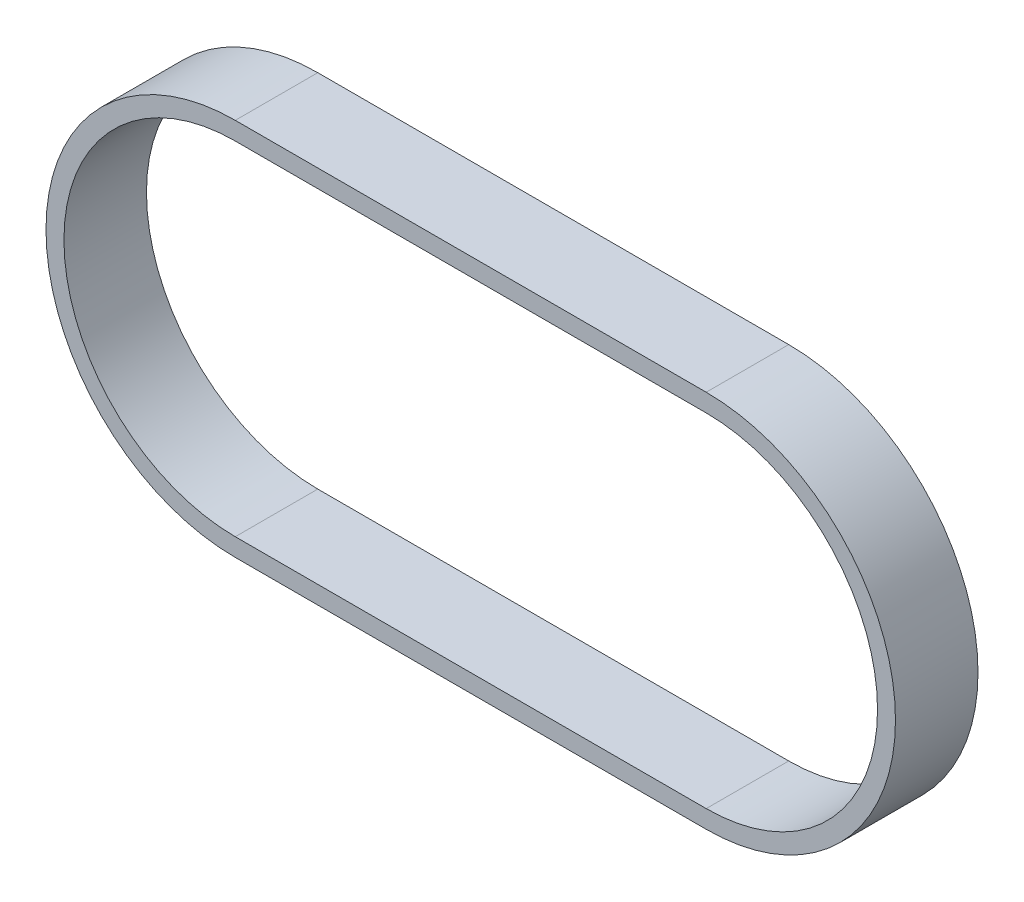
ISO-10303-21;
HEADER;
FILE_DESCRIPTION(('STEP AP214'),'2;1');
FILE_NAME('part.step','',(''),(''),'','','');
FILE_SCHEMA(('AUTOMOTIVE_DESIGN { 1 0 10303 214 1 1 1 1 }'));
ENDSEC;
DATA;
#1=APPLICATION_CONTEXT('core data for automotive mechanical design processes');
#2=APPLICATION_PROTOCOL_DEFINITION('international standard','automotive_design',2000,#1);
#3=PRODUCT_CONTEXT('',#1,'mechanical');
#4=PRODUCT('Part','Part','',(#3));
#5=PRODUCT_RELATED_PRODUCT_CATEGORY('part','',(#4));
#6=PRODUCT_DEFINITION_FORMATION('','',#4);
#7=PRODUCT_DEFINITION_CONTEXT('part definition',#1,'design');
#8=PRODUCT_DEFINITION('design','',#6,#7);
#9=PRODUCT_DEFINITION_SHAPE('','',#8);
#10=(LENGTH_UNIT() NAMED_UNIT(*) SI_UNIT(.MILLI.,.METRE.));
#11=(NAMED_UNIT(*) PLANE_ANGLE_UNIT() SI_UNIT($,.RADIAN.));
#12=(NAMED_UNIT(*) SI_UNIT($,.STERADIAN.) SOLID_ANGLE_UNIT());
#13=UNCERTAINTY_MEASURE_WITH_UNIT(LENGTH_MEASURE(1.E-05),#10,'distance_accuracy_value','');
#14=(GEOMETRIC_REPRESENTATION_CONTEXT(3) GLOBAL_UNCERTAINTY_ASSIGNED_CONTEXT((#13)) GLOBAL_UNIT_ASSIGNED_CONTEXT((#10,
#11,#12)) REPRESENTATION_CONTEXT('',''));
#15=CARTESIAN_POINT('',(0.,0.,0.));
#16=DIRECTION('',(0.,0.,1.));
#17=DIRECTION('',(1.,0.,0.));
#18=AXIS2_PLACEMENT_3D('',#15,#16,#17);
#19=CARTESIAN_POINT('',(0.,0.,9.2));
#20=DIRECTION('',(0.,0.,1.));
#21=DIRECTION('',(1.,0.,0.));
#22=AXIS2_PLACEMENT_3D('',#19,#20,#21);
#23=PLANE('',#22);
#24=CARTESIAN_POINT('',(0.,0.,9.2));
#25=DIRECTION('',(0.,0.,1.));
#26=DIRECTION('',(1.,0.,0.));
#27=AXIS2_PLACEMENT_3D('',#24,#25,#26);
#28=CIRCLE('',#27,21.1);
#29=CARTESIAN_POINT('',(0.,21.1,9.2));
#30=VERTEX_POINT('',#29);
#31=CARTESIAN_POINT('',(0.,-21.1,9.2));
#32=VERTEX_POINT('',#31);
#33=EDGE_CURVE('E160',#30,#32,#28,.T.);
#34=ORIENTED_EDGE('',*,*,#33,.T.);
#35=DIRECTION('',(1.,0.,0.));
#36=VECTOR('',#35,1.);
#37=CARTESIAN_POINT('',(0.,-21.1,9.2));
#38=LINE('',#37,#36);
#39=CARTESIAN_POINT('',(52.5,-21.1,9.2));
#40=VERTEX_POINT('',#39);
#41=EDGE_CURVE('E163',#32,#40,#38,.T.);
#42=ORIENTED_EDGE('',*,*,#41,.T.);
#43=CARTESIAN_POINT('',(52.5,0.,9.2));
#44=DIRECTION('',(0.,0.,1.));
#45=DIRECTION('',(1.,0.,0.));
#46=AXIS2_PLACEMENT_3D('',#43,#44,#45);
#47=CIRCLE('',#46,21.1);
#48=CARTESIAN_POINT('',(52.5,21.1,9.2));
#49=VERTEX_POINT('',#48);
#50=EDGE_CURVE('E166',#40,#49,#47,.T.);
#51=ORIENTED_EDGE('',*,*,#50,.T.);
#52=DIRECTION('',(-1.,0.,0.));
#53=VECTOR('',#52,1.);
#54=CARTESIAN_POINT('',(0.,21.1,9.2));
#55=LINE('',#54,#53);
#56=EDGE_CURVE('E168',#49,#30,#55,.T.);
#57=ORIENTED_EDGE('',*,*,#56,.T.);
#58=EDGE_LOOP('',(#34,#42,#51,#57));
#59=FACE_BOUND('',#58,.T.);
#60=DIRECTION('',(1.,0.,0.));
#61=VECTOR('',#60,1.);
#62=CARTESIAN_POINT('',(0.,-19.1,9.2));
#63=LINE('',#62,#61);
#64=CARTESIAN_POINT('',(0.,-19.1,9.2));
#65=VERTEX_POINT('',#64);
#66=CARTESIAN_POINT('',(52.5,-19.1,9.2));
#67=VERTEX_POINT('',#66);
#68=EDGE_CURVE('E132',#65,#67,#63,.T.);
#69=ORIENTED_EDGE('',*,*,#68,.F.);
#70=CARTESIAN_POINT('',(0.,0.,9.2));
#71=DIRECTION('',(0.,0.,1.));
#72=DIRECTION('',(1.,0.,0.));
#73=AXIS2_PLACEMENT_3D('',#70,#71,#72);
#74=CIRCLE('',#73,19.1);
#75=CARTESIAN_POINT('',(0.,19.1,9.2));
#76=VERTEX_POINT('',#75);
#77=EDGE_CURVE('E124',#76,#65,#74,.T.);
#78=ORIENTED_EDGE('',*,*,#77,.F.);
#79=DIRECTION('',(-1.,0.,0.));
#80=VECTOR('',#79,1.);
#81=CARTESIAN_POINT('',(0.,19.1,9.2));
#82=LINE('',#81,#80);
#83=CARTESIAN_POINT('',(52.5,19.1,9.2));
#84=VERTEX_POINT('',#83);
#85=EDGE_CURVE('E146',#84,#76,#82,.T.);
#86=ORIENTED_EDGE('',*,*,#85,.F.);
#87=CARTESIAN_POINT('',(52.5,0.,9.2));
#88=DIRECTION('',(0.,0.,1.));
#89=DIRECTION('',(1.,0.,0.));
#90=AXIS2_PLACEMENT_3D('',#87,#88,#89);
#91=CIRCLE('',#90,19.1);
#92=EDGE_CURVE('E144',#67,#84,#91,.T.);
#93=ORIENTED_EDGE('',*,*,#92,.F.);
#94=EDGE_LOOP('',(#69,#78,#86,#93));
#95=FACE_BOUND('',#94,.T.);
#96=ADVANCED_FACE('F59',(#59,#95),#23,.T.);
#97=CARTESIAN_POINT('',(0.,0.,0.));
#98=DIRECTION('',(0.,0.,1.));
#99=DIRECTION('',(1.,0.,0.));
#100=AXIS2_PLACEMENT_3D('',#97,#98,#99);
#101=PLANE('',#100);
#102=CARTESIAN_POINT('',(0.,0.,0.));
#103=DIRECTION('',(0.,0.,1.));
#104=DIRECTION('',(1.,0.,0.));
#105=AXIS2_PLACEMENT_3D('',#102,#103,#104);
#106=CIRCLE('',#105,21.1);
#107=CARTESIAN_POINT('',(0.,21.1,0.));
#108=VERTEX_POINT('',#107);
#109=CARTESIAN_POINT('',(0.,-21.1,0.));
#110=VERTEX_POINT('',#109);
#111=EDGE_CURVE('E140',#108,#110,#106,.T.);
#112=ORIENTED_EDGE('',*,*,#111,.F.);
#113=DIRECTION('',(-1.,0.,0.));
#114=VECTOR('',#113,1.);
#115=CARTESIAN_POINT('',(0.,21.1,0.));
#116=LINE('',#115,#114);
#117=CARTESIAN_POINT('',(52.5,21.1,0.));
#118=VERTEX_POINT('',#117);
#119=EDGE_CURVE('E164',#118,#108,#116,.T.);
#120=ORIENTED_EDGE('',*,*,#119,.F.);
#121=CARTESIAN_POINT('',(52.5,0.,0.));
#122=DIRECTION('',(0.,0.,1.));
#123=DIRECTION('',(1.,0.,0.));
#124=AXIS2_PLACEMENT_3D('',#121,#122,#123);
#125=CIRCLE('',#124,21.1);
#126=CARTESIAN_POINT('',(52.5,-21.1,0.));
#127=VERTEX_POINT('',#126);
#128=EDGE_CURVE('E175',#127,#118,#125,.T.);
#129=ORIENTED_EDGE('',*,*,#128,.F.);
#130=DIRECTION('',(1.,0.,0.));
#131=VECTOR('',#130,1.);
#132=CARTESIAN_POINT('',(0.,-21.1,0.));
#133=LINE('',#132,#131);
#134=EDGE_CURVE('E173',#110,#127,#133,.T.);
#135=ORIENTED_EDGE('',*,*,#134,.F.);
#136=EDGE_LOOP('',(#112,#120,#129,#135));
#137=FACE_BOUND('',#136,.T.);
#138=CARTESIAN_POINT('',(0.,0.,0.));
#139=DIRECTION('',(0.,0.,1.));
#140=DIRECTION('',(1.,0.,0.));
#141=AXIS2_PLACEMENT_3D('',#138,#139,#140);
#142=CIRCLE('',#141,19.1);
#143=CARTESIAN_POINT('',(0.,19.1,0.));
#144=VERTEX_POINT('',#143);
#145=CARTESIAN_POINT('',(0.,-19.1,0.));
#146=VERTEX_POINT('',#145);
#147=EDGE_CURVE('E82',#144,#146,#142,.T.);
#148=ORIENTED_EDGE('',*,*,#147,.T.);
#149=DIRECTION('',(1.,0.,0.));
#150=VECTOR('',#149,1.);
#151=CARTESIAN_POINT('',(0.,-19.1,0.));
#152=LINE('',#151,#150);
#153=CARTESIAN_POINT('',(52.5,-19.1,0.));
#154=VERTEX_POINT('',#153);
#155=EDGE_CURVE('E139',#146,#154,#152,.T.);
#156=ORIENTED_EDGE('',*,*,#155,.T.);
#157=CARTESIAN_POINT('',(52.5,0.,0.));
#158=DIRECTION('',(0.,0.,1.));
#159=DIRECTION('',(1.,0.,0.));
#160=AXIS2_PLACEMENT_3D('',#157,#158,#159);
#161=CIRCLE('',#160,19.1);
#162=CARTESIAN_POINT('',(52.5,19.1,0.));
#163=VERTEX_POINT('',#162);
#164=EDGE_CURVE('E152',#154,#163,#161,.T.);
#165=ORIENTED_EDGE('',*,*,#164,.T.);
#166=DIRECTION('',(-1.,0.,0.));
#167=VECTOR('',#166,1.);
#168=CARTESIAN_POINT('',(0.,19.1,0.));
#169=LINE('',#168,#167);
#170=EDGE_CURVE('E133',#163,#144,#169,.T.);
#171=ORIENTED_EDGE('',*,*,#170,.T.);
#172=EDGE_LOOP('',(#148,#156,#165,#171));
#173=FACE_BOUND('',#172,.T.);
#174=ADVANCED_FACE('F193',(#137,#173),#101,.F.);
#175=CARTESIAN_POINT('',(0.,0.,9.2));
#176=DIRECTION('',(0.,0.,-1.));
#177=DIRECTION('',(-1.,0.,0.));
#178=AXIS2_PLACEMENT_3D('',#175,#176,#177);
#179=CYLINDRICAL_SURFACE('',#178,21.1);
#180=ORIENTED_EDGE('',*,*,#111,.T.);
#181=DIRECTION('',(0.,0.,-1.));
#182=VECTOR('',#181,1.);
#183=CARTESIAN_POINT('',(0.,-21.1,9.2));
#184=LINE('',#183,#182);
#185=EDGE_CURVE('E12',#32,#110,#184,.T.);
#186=ORIENTED_EDGE('',*,*,#185,.F.);
#187=ORIENTED_EDGE('',*,*,#33,.F.);
#188=DIRECTION('',(0.,0.,-1.));
#189=VECTOR('',#188,1.);
#190=CARTESIAN_POINT('',(0.,21.1,9.2));
#191=LINE('',#190,#189);
#192=EDGE_CURVE('E170',#30,#108,#191,.T.);
#193=ORIENTED_EDGE('',*,*,#192,.T.);
#194=EDGE_LOOP('',(#180,#186,#187,#193));
#195=FACE_BOUND('',#194,.T.);
#196=ADVANCED_FACE('F61',(#195),#179,.T.);
#197=CARTESIAN_POINT('',(0.,-21.1,9.2));
#198=DIRECTION('',(0.,1.,0.));
#199=DIRECTION('',(-1.,0.,0.));
#200=AXIS2_PLACEMENT_3D('',#197,#198,#199);
#201=PLANE('',#200);
#202=ORIENTED_EDGE('',*,*,#134,.T.);
#203=DIRECTION('',(0.,0.,-1.));
#204=VECTOR('',#203,1.);
#205=CARTESIAN_POINT('',(52.5,-21.1,9.2));
#206=LINE('',#205,#204);
#207=EDGE_CURVE('E67',#40,#127,#206,.T.);
#208=ORIENTED_EDGE('',*,*,#207,.F.);
#209=ORIENTED_EDGE('',*,*,#41,.F.);
#210=ORIENTED_EDGE('',*,*,#185,.T.);
#211=EDGE_LOOP('',(#202,#208,#209,#210));
#212=FACE_BOUND('',#211,.T.);
#213=ADVANCED_FACE('F203',(#212),#201,.F.);
#214=CARTESIAN_POINT('',(52.5,0.,9.2));
#215=DIRECTION('',(0.,0.,-1.));
#216=DIRECTION('',(-1.,0.,0.));
#217=AXIS2_PLACEMENT_3D('',#214,#215,#216);
#218=CYLINDRICAL_SURFACE('',#217,21.1);
#219=ORIENTED_EDGE('',*,*,#128,.T.);
#220=DIRECTION('',(0.,0.,-1.));
#221=VECTOR('',#220,1.);
#222=CARTESIAN_POINT('',(52.5,21.1,9.2));
#223=LINE('',#222,#221);
#224=EDGE_CURVE('E180',#49,#118,#223,.T.);
#225=ORIENTED_EDGE('',*,*,#224,.F.);
#226=ORIENTED_EDGE('',*,*,#50,.F.);
#227=ORIENTED_EDGE('',*,*,#207,.T.);
#228=EDGE_LOOP('',(#219,#225,#226,#227));
#229=FACE_BOUND('',#228,.T.);
#230=ADVANCED_FACE('F187',(#229),#218,.T.);
#231=CARTESIAN_POINT('',(0.,21.1,9.2));
#232=DIRECTION('',(0.,-1.,0.));
#233=DIRECTION('',(1.,0.,0.));
#234=AXIS2_PLACEMENT_3D('',#231,#232,#233);
#235=PLANE('',#234);
#236=ORIENTED_EDGE('',*,*,#119,.T.);
#237=ORIENTED_EDGE('',*,*,#192,.F.);
#238=ORIENTED_EDGE('',*,*,#56,.F.);
#239=ORIENTED_EDGE('',*,*,#224,.T.);
#240=EDGE_LOOP('',(#236,#237,#238,#239));
#241=FACE_BOUND('',#240,.T.);
#242=ADVANCED_FACE('F197',(#241),#235,.F.);
#243=CARTESIAN_POINT('',(0.,0.,9.2));
#244=DIRECTION('',(0.,0.,-1.));
#245=DIRECTION('',(-1.,0.,0.));
#246=AXIS2_PLACEMENT_3D('',#243,#244,#245);
#247=CYLINDRICAL_SURFACE('',#246,19.1);
#248=ORIENTED_EDGE('',*,*,#147,.F.);
#249=DIRECTION('',(0.,0.,-1.));
#250=VECTOR('',#249,1.);
#251=CARTESIAN_POINT('',(0.,19.1,9.2));
#252=LINE('',#251,#250);
#253=EDGE_CURVE('E128',#76,#144,#252,.T.);
#254=ORIENTED_EDGE('',*,*,#253,.F.);
#255=ORIENTED_EDGE('',*,*,#77,.T.);
#256=DIRECTION('',(0.,0.,-1.));
#257=VECTOR('',#256,1.);
#258=CARTESIAN_POINT('',(0.,-19.1,9.2));
#259=LINE('',#258,#257);
#260=EDGE_CURVE('E127',#65,#146,#259,.T.);
#261=ORIENTED_EDGE('',*,*,#260,.T.);
#262=EDGE_LOOP('',(#248,#254,#255,#261));
#263=FACE_BOUND('',#262,.T.);
#264=ADVANCED_FACE('F126',(#263),#247,.F.);
#265=CARTESIAN_POINT('',(0.,-19.1,9.2));
#266=DIRECTION('',(0.,1.,0.));
#267=DIRECTION('',(-1.,0.,0.));
#268=AXIS2_PLACEMENT_3D('',#265,#266,#267);
#269=PLANE('',#268);
#270=ORIENTED_EDGE('',*,*,#155,.F.);
#271=ORIENTED_EDGE('',*,*,#260,.F.);
#272=ORIENTED_EDGE('',*,*,#68,.T.);
#273=DIRECTION('',(0.,0.,-1.));
#274=VECTOR('',#273,1.);
#275=CARTESIAN_POINT('',(52.5,-19.1,9.2));
#276=LINE('',#275,#274);
#277=EDGE_CURVE('E141',#67,#154,#276,.T.);
#278=ORIENTED_EDGE('',*,*,#277,.T.);
#279=EDGE_LOOP('',(#270,#271,#272,#278));
#280=FACE_BOUND('',#279,.T.);
#281=ADVANCED_FACE('F136',(#280),#269,.T.);
#282=CARTESIAN_POINT('',(52.5,0.,9.2));
#283=DIRECTION('',(0.,0.,-1.));
#284=DIRECTION('',(-1.,0.,0.));
#285=AXIS2_PLACEMENT_3D('',#282,#283,#284);
#286=CYLINDRICAL_SURFACE('',#285,19.1);
#287=ORIENTED_EDGE('',*,*,#164,.F.);
#288=ORIENTED_EDGE('',*,*,#277,.F.);
#289=ORIENTED_EDGE('',*,*,#92,.T.);
#290=DIRECTION('',(0.,0.,-1.));
#291=VECTOR('',#290,1.);
#292=CARTESIAN_POINT('',(52.5,19.1,9.2));
#293=LINE('',#292,#291);
#294=EDGE_CURVE('E74',#84,#163,#293,.T.);
#295=ORIENTED_EDGE('',*,*,#294,.T.);
#296=EDGE_LOOP('',(#287,#288,#289,#295));
#297=FACE_BOUND('',#296,.T.);
#298=ADVANCED_FACE('F226',(#297),#286,.F.);
#299=CARTESIAN_POINT('',(0.,19.1,9.2));
#300=DIRECTION('',(0.,-1.,0.));
#301=DIRECTION('',(1.,0.,0.));
#302=AXIS2_PLACEMENT_3D('',#299,#300,#301);
#303=PLANE('',#302);
#304=ORIENTED_EDGE('',*,*,#170,.F.);
#305=ORIENTED_EDGE('',*,*,#294,.F.);
#306=ORIENTED_EDGE('',*,*,#85,.T.);
#307=ORIENTED_EDGE('',*,*,#253,.T.);
#308=EDGE_LOOP('',(#304,#305,#306,#307));
#309=FACE_BOUND('',#308,.T.);
#310=ADVANCED_FACE('F230',(#309),#303,.T.);
#311=CLOSED_SHELL('',(#96,#174,#196,#213,#230,#242,#264,#281,#298,#310));
#312=MANIFOLD_SOLID_BREP('B2',#311);
#313=ADVANCED_BREP_SHAPE_REPRESENTATION('',(#18,#312),#14);
#314=SHAPE_DEFINITION_REPRESENTATION(#9,#313);
ENDSEC;
END-ISO-10303-21;
